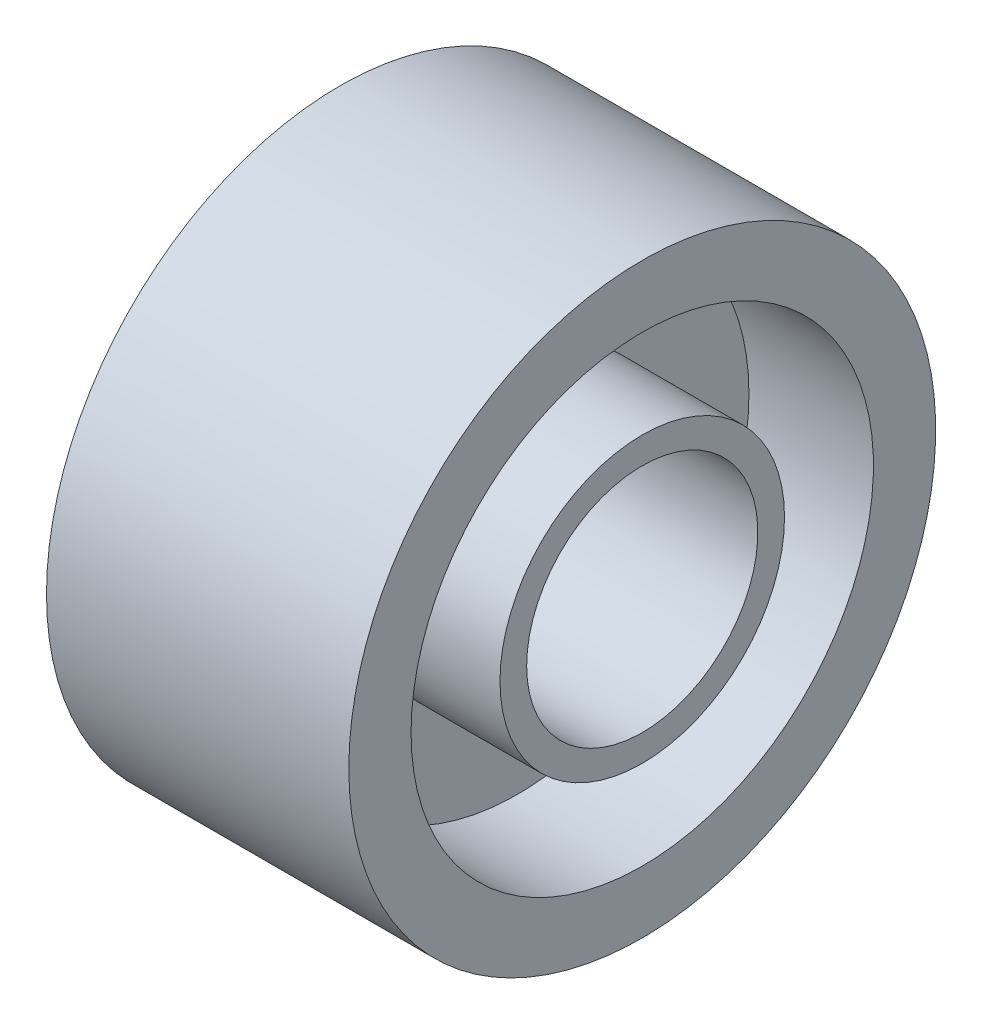
ISO-10303-21;
HEADER;
FILE_DESCRIPTION(('STEP AP214'),'2;1');
FILE_NAME('part.step','',(''),(''),'','','');
FILE_SCHEMA(('AUTOMOTIVE_DESIGN { 1 0 10303 214 1 1 1 1 }'));
ENDSEC;
DATA;
#1=APPLICATION_CONTEXT('core data for automotive mechanical design processes');
#2=APPLICATION_PROTOCOL_DEFINITION('international standard','automotive_design',2000,#1);
#3=PRODUCT_CONTEXT('',#1,'mechanical');
#4=PRODUCT('Part','Part','',(#3));
#5=PRODUCT_RELATED_PRODUCT_CATEGORY('part','',(#4));
#6=PRODUCT_DEFINITION_FORMATION('','',#4);
#7=PRODUCT_DEFINITION_CONTEXT('part definition',#1,'design');
#8=PRODUCT_DEFINITION('design','',#6,#7);
#9=PRODUCT_DEFINITION_SHAPE('','',#8);
#10=(LENGTH_UNIT() NAMED_UNIT(*) SI_UNIT(.MILLI.,.METRE.));
#11=(NAMED_UNIT(*) PLANE_ANGLE_UNIT() SI_UNIT($,.RADIAN.));
#12=(NAMED_UNIT(*) SI_UNIT($,.STERADIAN.) SOLID_ANGLE_UNIT());
#13=UNCERTAINTY_MEASURE_WITH_UNIT(LENGTH_MEASURE(1.E-05),#10,'distance_accuracy_value','');
#14=(GEOMETRIC_REPRESENTATION_CONTEXT(3) GLOBAL_UNCERTAINTY_ASSIGNED_CONTEXT((#13)) GLOBAL_UNIT_ASSIGNED_CONTEXT((#10,
#11,#12)) REPRESENTATION_CONTEXT('',''));
#15=CARTESIAN_POINT('',(0.,0.,0.));
#16=DIRECTION('',(0.,0.,1.));
#17=DIRECTION('',(1.,0.,0.));
#18=AXIS2_PLACEMENT_3D('',#15,#16,#17);
#19=CARTESIAN_POINT('',(1.5,0.,0.));
#20=DIRECTION('',(1.,0.,0.));
#21=DIRECTION('',(0.,0.,-1.));
#22=AXIS2_PLACEMENT_3D('',#19,#20,#21);
#23=PLANE('',#22);
#24=CARTESIAN_POINT('',(1.5,0.,0.));
#25=DIRECTION('',(1.,0.,0.));
#26=DIRECTION('',(0.,0.,-1.));
#27=AXIS2_PLACEMENT_3D('',#24,#25,#26);
#28=CIRCLE('',#27,8.);
#29=CARTESIAN_POINT('',(1.5,0.,-8.));
#30=VERTEX_POINT('',#29);
#31=EDGE_CURVE('E66',#30,#30,#28,.T.);
#32=ORIENTED_EDGE('',*,*,#31,.F.);
#33=EDGE_LOOP('',(#32));
#34=FACE_BOUND('',#33,.T.);
#35=CARTESIAN_POINT('',(1.5,0.,0.));
#36=DIRECTION('',(1.,0.,0.));
#37=DIRECTION('',(0.,0.,-1.));
#38=AXIS2_PLACEMENT_3D('',#35,#36,#37);
#39=CIRCLE('',#38,13.);
#40=CARTESIAN_POINT('',(1.5,0.,-13.));
#41=VERTEX_POINT('',#40);
#42=EDGE_CURVE('E88',#41,#41,#39,.T.);
#43=ORIENTED_EDGE('',*,*,#42,.T.);
#44=EDGE_LOOP('',(#43));
#45=FACE_BOUND('',#44,.T.);
#46=ADVANCED_FACE('F59',(#34,#45),#23,.T.);
#47=CARTESIAN_POINT('',(8.5,0.,0.));
#48=DIRECTION('',(-1.,0.,0.));
#49=DIRECTION('',(0.,0.,1.));
#50=AXIS2_PLACEMENT_3D('',#47,#48,#49);
#51=CYLINDRICAL_SURFACE('',#50,8.);
#52=ORIENTED_EDGE('',*,*,#31,.T.);
#53=EDGE_LOOP('',(#52));
#54=FACE_BOUND('',#53,.T.);
#55=CARTESIAN_POINT('',(8.5,0.,0.));
#56=DIRECTION('',(-1.,0.,0.));
#57=DIRECTION('',(0.,0.,1.));
#58=AXIS2_PLACEMENT_3D('',#55,#56,#57);
#59=CIRCLE('',#58,8.);
#60=CARTESIAN_POINT('',(8.5,0.,8.));
#61=VERTEX_POINT('',#60);
#62=EDGE_CURVE('E75',#61,#61,#59,.T.);
#63=ORIENTED_EDGE('',*,*,#62,.T.);
#64=EDGE_LOOP('',(#63));
#65=FACE_BOUND('',#64,.T.);
#66=ADVANCED_FACE('F129',(#54,#65),#51,.T.);
#67=CARTESIAN_POINT('',(8.5,0.,0.));
#68=DIRECTION('',(-1.,0.,0.));
#69=DIRECTION('',(0.,0.,1.));
#70=AXIS2_PLACEMENT_3D('',#67,#68,#69);
#71=PLANE('',#70);
#72=CARTESIAN_POINT('',(8.5,0.,0.));
#73=DIRECTION('',(-1.,0.,0.));
#74=DIRECTION('',(0.,0.,1.));
#75=AXIS2_PLACEMENT_3D('',#72,#73,#74);
#76=CIRCLE('',#75,6.5);
#77=CARTESIAN_POINT('',(8.5,0.,6.5));
#78=VERTEX_POINT('',#77);
#79=EDGE_CURVE('E79',#78,#78,#76,.T.);
#80=ORIENTED_EDGE('',*,*,#79,.T.);
#81=EDGE_LOOP('',(#80));
#82=FACE_BOUND('',#81,.T.);
#83=ORIENTED_EDGE('',*,*,#62,.F.);
#84=EDGE_LOOP('',(#83));
#85=FACE_BOUND('',#84,.T.);
#86=ADVANCED_FACE('F125',(#82,#85),#71,.F.);
#87=CARTESIAN_POINT('',(8.5,0.,0.));
#88=DIRECTION('',(-1.,0.,0.));
#89=DIRECTION('',(0.,0.,1.));
#90=AXIS2_PLACEMENT_3D('',#87,#88,#89);
#91=CYLINDRICAL_SURFACE('',#90,13.);
#92=ORIENTED_EDGE('',*,*,#42,.F.);
#93=EDGE_LOOP('',(#92));
#94=FACE_BOUND('',#93,.T.);
#95=CARTESIAN_POINT('',(8.5,0.,0.));
#96=DIRECTION('',(-1.,0.,0.));
#97=DIRECTION('',(0.,0.,1.));
#98=AXIS2_PLACEMENT_3D('',#95,#96,#97);
#99=CIRCLE('',#98,13.);
#100=CARTESIAN_POINT('',(8.5,0.,13.));
#101=VERTEX_POINT('',#100);
#102=EDGE_CURVE('E94',#101,#101,#99,.T.);
#103=ORIENTED_EDGE('',*,*,#102,.F.);
#104=EDGE_LOOP('',(#103));
#105=FACE_BOUND('',#104,.T.);
#106=ADVANCED_FACE('F119',(#94,#105),#91,.F.);
#107=CARTESIAN_POINT('',(8.5,0.,0.));
#108=DIRECTION('',(-1.,0.,0.));
#109=DIRECTION('',(0.,0.,1.));
#110=AXIS2_PLACEMENT_3D('',#107,#108,#109);
#111=PLANE('',#110);
#112=ORIENTED_EDGE('',*,*,#102,.T.);
#113=EDGE_LOOP('',(#112));
#114=FACE_BOUND('',#113,.T.);
#115=CARTESIAN_POINT('',(8.5,0.,0.));
#116=DIRECTION('',(-1.,0.,0.));
#117=DIRECTION('',(0.,0.,1.));
#118=AXIS2_PLACEMENT_3D('',#115,#116,#117);
#119=CIRCLE('',#118,16.5);
#120=CARTESIAN_POINT('',(8.5,0.,16.5));
#121=VERTEX_POINT('',#120);
#122=EDGE_CURVE('E91',#121,#121,#119,.T.);
#123=ORIENTED_EDGE('',*,*,#122,.F.);
#124=EDGE_LOOP('',(#123));
#125=FACE_BOUND('',#124,.T.);
#126=ADVANCED_FACE('F115',(#114,#125),#111,.F.);
#127=CARTESIAN_POINT('',(-1.5,0.,0.));
#128=DIRECTION('',(1.,0.,0.));
#129=DIRECTION('',(0.,0.,-1.));
#130=AXIS2_PLACEMENT_3D('',#127,#128,#129);
#131=CYLINDRICAL_SURFACE('',#130,16.5);
#132=CARTESIAN_POINT('',(-8.5,0.,0.));
#133=DIRECTION('',(-1.,0.,0.));
#134=DIRECTION('',(0.,0.,1.));
#135=AXIS2_PLACEMENT_3D('',#132,#133,#134);
#136=CIRCLE('',#135,16.5);
#137=CARTESIAN_POINT('',(-8.5,0.,16.5));
#138=VERTEX_POINT('',#137);
#139=EDGE_CURVE('E97',#138,#138,#136,.T.);
#140=ORIENTED_EDGE('',*,*,#139,.F.);
#141=EDGE_LOOP('',(#140));
#142=FACE_BOUND('',#141,.T.);
#143=ORIENTED_EDGE('',*,*,#122,.T.);
#144=EDGE_LOOP('',(#143));
#145=FACE_BOUND('',#144,.T.);
#146=ADVANCED_FACE('F61',(#142,#145),#131,.T.);
#147=CARTESIAN_POINT('',(-8.5,0.,0.));
#148=DIRECTION('',(-1.,0.,0.));
#149=DIRECTION('',(0.,0.,1.));
#150=AXIS2_PLACEMENT_3D('',#147,#148,#149);
#151=CIRCLE('',#150,13.);
#152=CARTESIAN_POINT('',(-8.5,0.,13.));
#153=VERTEX_POINT('',#152);
#154=EDGE_CURVE('E100',#153,#153,#151,.T.);
#155=ORIENTED_EDGE('',*,*,#154,.T.);
#156=EDGE_LOOP('',(#155));
#157=FACE_BOUND('',#156,.T.);
#158=CARTESIAN_POINT('',(-1.5,0.,0.));
#159=DIRECTION('',(1.,0.,0.));
#160=DIRECTION('',(0.,0.,-1.));
#161=AXIS2_PLACEMENT_3D('',#158,#159,#160);
#162=CIRCLE('',#161,13.);
#163=CARTESIAN_POINT('',(-1.5,0.,-13.));
#164=VERTEX_POINT('',#163);
#165=EDGE_CURVE('E11',#164,#164,#162,.T.);
#166=ORIENTED_EDGE('',*,*,#165,.T.);
#167=EDGE_LOOP('',(#166));
#168=FACE_BOUND('',#167,.T.);
#169=ADVANCED_FACE('F104',(#157,#168),#91,.F.);
#170=CARTESIAN_POINT('',(-8.5,0.,0.));
#171=DIRECTION('',(-1.,0.,0.));
#172=DIRECTION('',(0.,0.,1.));
#173=AXIS2_PLACEMENT_3D('',#170,#171,#172);
#174=PLANE('',#173);
#175=ORIENTED_EDGE('',*,*,#154,.F.);
#176=EDGE_LOOP('',(#175));
#177=FACE_BOUND('',#176,.T.);
#178=ORIENTED_EDGE('',*,*,#139,.T.);
#179=EDGE_LOOP('',(#178));
#180=FACE_BOUND('',#179,.T.);
#181=ADVANCED_FACE('F106',(#177,#180),#174,.T.);
#182=CARTESIAN_POINT('',(8.5,0.,0.));
#183=DIRECTION('',(-1.,0.,0.));
#184=DIRECTION('',(0.,0.,1.));
#185=AXIS2_PLACEMENT_3D('',#182,#183,#184);
#186=CYLINDRICAL_SURFACE('',#185,6.5);
#187=CARTESIAN_POINT('',(-8.5,0.,0.));
#188=DIRECTION('',(-1.,0.,0.));
#189=DIRECTION('',(0.,0.,1.));
#190=AXIS2_PLACEMENT_3D('',#187,#188,#189);
#191=CIRCLE('',#190,6.5);
#192=CARTESIAN_POINT('',(-8.5,0.,6.5));
#193=VERTEX_POINT('',#192);
#194=EDGE_CURVE('E85',#193,#193,#191,.T.);
#195=ORIENTED_EDGE('',*,*,#194,.T.);
#196=EDGE_LOOP('',(#195));
#197=FACE_BOUND('',#196,.T.);
#198=ORIENTED_EDGE('',*,*,#79,.F.);
#199=EDGE_LOOP('',(#198));
#200=FACE_BOUND('',#199,.T.);
#201=ADVANCED_FACE('F109',(#197,#200),#186,.F.);
#202=CARTESIAN_POINT('',(-8.5,0.,0.));
#203=DIRECTION('',(-1.,0.,0.));
#204=DIRECTION('',(0.,0.,1.));
#205=AXIS2_PLACEMENT_3D('',#202,#203,#204);
#206=PLANE('',#205);
#207=ORIENTED_EDGE('',*,*,#194,.F.);
#208=EDGE_LOOP('',(#207));
#209=FACE_BOUND('',#208,.T.);
#210=CARTESIAN_POINT('',(-8.5,0.,0.));
#211=DIRECTION('',(-1.,0.,0.));
#212=DIRECTION('',(0.,0.,1.));
#213=AXIS2_PLACEMENT_3D('',#210,#211,#212);
#214=CIRCLE('',#213,8.);
#215=CARTESIAN_POINT('',(-8.5,0.,8.));
#216=VERTEX_POINT('',#215);
#217=EDGE_CURVE('E82',#216,#216,#214,.T.);
#218=ORIENTED_EDGE('',*,*,#217,.T.);
#219=EDGE_LOOP('',(#218));
#220=FACE_BOUND('',#219,.T.);
#221=ADVANCED_FACE('F145',(#209,#220),#206,.T.);
#222=ORIENTED_EDGE('',*,*,#217,.F.);
#223=EDGE_LOOP('',(#222));
#224=FACE_BOUND('',#223,.T.);
#225=CARTESIAN_POINT('',(-1.5,0.,0.));
#226=DIRECTION('',(1.,0.,0.));
#227=DIRECTION('',(0.,0.,-1.));
#228=AXIS2_PLACEMENT_3D('',#225,#226,#227);
#229=CIRCLE('',#228,8.);
#230=CARTESIAN_POINT('',(-1.5,0.,-8.));
#231=VERTEX_POINT('',#230);
#232=EDGE_CURVE('E70',#231,#231,#229,.T.);
#233=ORIENTED_EDGE('',*,*,#232,.F.);
#234=EDGE_LOOP('',(#233));
#235=FACE_BOUND('',#234,.T.);
#236=ADVANCED_FACE('F136',(#224,#235),#51,.T.);
#237=CARTESIAN_POINT('',(-1.5,0.,0.));
#238=DIRECTION('',(1.,0.,0.));
#239=DIRECTION('',(0.,0.,-1.));
#240=AXIS2_PLACEMENT_3D('',#237,#238,#239);
#241=PLANE('',#240);
#242=ORIENTED_EDGE('',*,*,#232,.T.);
#243=EDGE_LOOP('',(#242));
#244=FACE_BOUND('',#243,.T.);
#245=ORIENTED_EDGE('',*,*,#165,.F.);
#246=EDGE_LOOP('',(#245));
#247=FACE_BOUND('',#246,.T.);
#248=ADVANCED_FACE('F139',(#244,#247),#241,.F.);
#249=CLOSED_SHELL('',(#46,#66,#86,#106,#126,#146,#169,#181,#201,#221,#236,#248));
#250=MANIFOLD_SOLID_BREP('B2',#249);
#251=ADVANCED_BREP_SHAPE_REPRESENTATION('',(#18,#250),#14);
#252=SHAPE_DEFINITION_REPRESENTATION(#9,#251);
ENDSEC;
END-ISO-10303-21;
